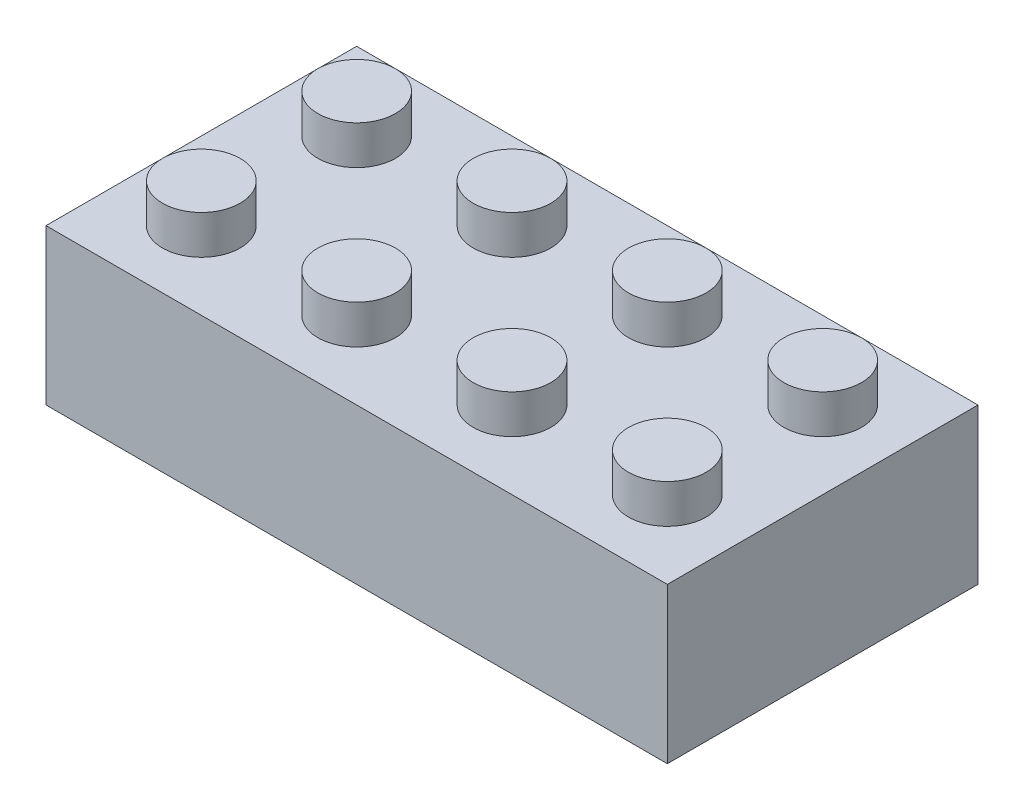
ISO-10303-21;
HEADER;
FILE_DESCRIPTION(('STEP AP214'),'2;1');
FILE_NAME('part.step','',(''),(''),'','','');
FILE_SCHEMA(('AUTOMOTIVE_DESIGN { 1 0 10303 214 1 1 1 1 }'));
ENDSEC;
DATA;
#1=APPLICATION_CONTEXT('core data for automotive mechanical design processes');
#2=APPLICATION_PROTOCOL_DEFINITION('international standard','automotive_design',2000,#1);
#3=PRODUCT_CONTEXT('',#1,'mechanical');
#4=PRODUCT('Part','Part','',(#3));
#5=PRODUCT_RELATED_PRODUCT_CATEGORY('part','',(#4));
#6=PRODUCT_DEFINITION_FORMATION('','',#4);
#7=PRODUCT_DEFINITION_CONTEXT('part definition',#1,'design');
#8=PRODUCT_DEFINITION('design','',#6,#7);
#9=PRODUCT_DEFINITION_SHAPE('','',#8);
#10=(LENGTH_UNIT() NAMED_UNIT(*) SI_UNIT(.MILLI.,.METRE.));
#11=(NAMED_UNIT(*) PLANE_ANGLE_UNIT() SI_UNIT($,.RADIAN.));
#12=(NAMED_UNIT(*) SI_UNIT($,.STERADIAN.) SOLID_ANGLE_UNIT());
#13=UNCERTAINTY_MEASURE_WITH_UNIT(LENGTH_MEASURE(1.E-05),#10,'distance_accuracy_value','');
#14=(GEOMETRIC_REPRESENTATION_CONTEXT(3) GLOBAL_UNCERTAINTY_ASSIGNED_CONTEXT((#13)) GLOBAL_UNIT_ASSIGNED_CONTEXT((#10,
#11,#12)) REPRESENTATION_CONTEXT('',''));
#15=CARTESIAN_POINT('',(0.,0.,0.));
#16=DIRECTION('',(0.,0.,1.));
#17=DIRECTION('',(1.,0.,0.));
#18=AXIS2_PLACEMENT_3D('',#15,#16,#17);
#19=CARTESIAN_POINT('',(17.78,6.35,-7.62));
#20=DIRECTION('',(0.,1.,0.));
#21=DIRECTION('',(0.,0.,1.));
#22=AXIS2_PLACEMENT_3D('',#19,#20,#21);
#23=PLANE('',#22);
#24=CARTESIAN_POINT('',(17.78,6.35,-7.62));
#25=DIRECTION('',(0.,1.,0.));
#26=DIRECTION('',(0.,0.,1.));
#27=AXIS2_PLACEMENT_3D('',#24,#25,#26);
#28=CIRCLE('',#27,1.27);
#29=CARTESIAN_POINT('',(17.78,6.35,-6.35));
#30=VERTEX_POINT('',#29);
#31=EDGE_CURVE('E11',#30,#30,#28,.T.);
#32=ORIENTED_EDGE('',*,*,#31,.T.);
#33=EDGE_LOOP('',(#32));
#34=FACE_BOUND('',#33,.T.);
#35=ADVANCED_FACE('F38',(#34),#23,.T.);
#36=CARTESIAN_POINT('',(17.78,6.35,-7.62));
#37=DIRECTION('',(0.,-1.,0.));
#38=DIRECTION('',(0.,0.,-1.));
#39=AXIS2_PLACEMENT_3D('',#36,#37,#38);
#40=CYLINDRICAL_SURFACE('',#39,1.27);
#41=ORIENTED_EDGE('',*,*,#31,.F.);
#42=EDGE_LOOP('',(#41));
#43=FACE_BOUND('',#42,.T.);
#44=CARTESIAN_POINT('',(17.78,5.08,-7.62));
#45=DIRECTION('',(0.,-1.,0.));
#46=DIRECTION('',(0.,0.,-1.));
#47=AXIS2_PLACEMENT_3D('',#44,#45,#46);
#48=CIRCLE('',#47,1.27);
#49=CARTESIAN_POINT('',(17.78,5.08,-8.89));
#50=VERTEX_POINT('',#49);
#51=EDGE_CURVE('E46',#50,#50,#48,.F.);
#52=ORIENTED_EDGE('',*,*,#51,.T.);
#53=EDGE_LOOP('',(#52));
#54=FACE_BOUND('',#53,.T.);
#55=ADVANCED_FACE('F154',(#43,#54),#40,.T.);
#56=CARTESIAN_POINT('',(12.7,6.35,-7.62));
#57=DIRECTION('',(0.,1.,0.));
#58=DIRECTION('',(0.,0.,1.));
#59=AXIS2_PLACEMENT_3D('',#56,#57,#58);
#60=PLANE('',#59);
#61=CARTESIAN_POINT('',(12.7,6.35,-7.62));
#62=DIRECTION('',(0.,1.,0.));
#63=DIRECTION('',(0.,0.,1.));
#64=AXIS2_PLACEMENT_3D('',#61,#62,#63);
#65=CIRCLE('',#64,1.27);
#66=CARTESIAN_POINT('',(12.7,6.35,-6.35));
#67=VERTEX_POINT('',#66);
#68=EDGE_CURVE('E149',#67,#67,#65,.T.);
#69=ORIENTED_EDGE('',*,*,#68,.T.);
#70=EDGE_LOOP('',(#69));
#71=FACE_BOUND('',#70,.T.);
#72=ADVANCED_FACE('F177',(#71),#60,.T.);
#73=CARTESIAN_POINT('',(12.7,6.35,-7.62));
#74=DIRECTION('',(0.,-1.,0.));
#75=DIRECTION('',(0.,0.,-1.));
#76=AXIS2_PLACEMENT_3D('',#73,#74,#75);
#77=CYLINDRICAL_SURFACE('',#76,1.27);
#78=ORIENTED_EDGE('',*,*,#68,.F.);
#79=EDGE_LOOP('',(#78));
#80=FACE_BOUND('',#79,.T.);
#81=CARTESIAN_POINT('',(12.7,5.08,-7.62));
#82=DIRECTION('',(0.,-1.,0.));
#83=DIRECTION('',(0.,0.,-1.));
#84=AXIS2_PLACEMENT_3D('',#81,#82,#83);
#85=CIRCLE('',#84,1.27);
#86=CARTESIAN_POINT('',(12.7,5.08,-8.89));
#87=VERTEX_POINT('',#86);
#88=EDGE_CURVE('E146',#87,#87,#85,.F.);
#89=ORIENTED_EDGE('',*,*,#88,.T.);
#90=EDGE_LOOP('',(#89));
#91=FACE_BOUND('',#90,.T.);
#92=ADVANCED_FACE('F183',(#80,#91),#77,.T.);
#93=CARTESIAN_POINT('',(7.62,6.35,-7.62));
#94=DIRECTION('',(0.,1.,0.));
#95=DIRECTION('',(0.,0.,1.));
#96=AXIS2_PLACEMENT_3D('',#93,#94,#95);
#97=PLANE('',#96);
#98=CARTESIAN_POINT('',(7.62,6.35,-7.62));
#99=DIRECTION('',(0.,1.,0.));
#100=DIRECTION('',(0.,0.,1.));
#101=AXIS2_PLACEMENT_3D('',#98,#99,#100);
#102=CIRCLE('',#101,1.27);
#103=CARTESIAN_POINT('',(7.62,6.35,-6.35));
#104=VERTEX_POINT('',#103);
#105=EDGE_CURVE('E143',#104,#104,#102,.T.);
#106=ORIENTED_EDGE('',*,*,#105,.T.);
#107=EDGE_LOOP('',(#106));
#108=FACE_BOUND('',#107,.T.);
#109=ADVANCED_FACE('F189',(#108),#97,.T.);
#110=CARTESIAN_POINT('',(7.62,6.35,-7.62));
#111=DIRECTION('',(0.,-1.,0.));
#112=DIRECTION('',(0.,0.,-1.));
#113=AXIS2_PLACEMENT_3D('',#110,#111,#112);
#114=CYLINDRICAL_SURFACE('',#113,1.27);
#115=ORIENTED_EDGE('',*,*,#105,.F.);
#116=EDGE_LOOP('',(#115));
#117=FACE_BOUND('',#116,.T.);
#118=CARTESIAN_POINT('',(7.62,5.08,-7.62));
#119=DIRECTION('',(0.,-1.,0.));
#120=DIRECTION('',(0.,0.,-1.));
#121=AXIS2_PLACEMENT_3D('',#118,#119,#120);
#122=CIRCLE('',#121,1.27);
#123=CARTESIAN_POINT('',(7.62,5.08,-8.89));
#124=VERTEX_POINT('',#123);
#125=EDGE_CURVE('E140',#124,#124,#122,.F.);
#126=ORIENTED_EDGE('',*,*,#125,.T.);
#127=EDGE_LOOP('',(#126));
#128=FACE_BOUND('',#127,.T.);
#129=ADVANCED_FACE('F193',(#117,#128),#114,.T.);
#130=CARTESIAN_POINT('',(2.54,6.35,-7.62));
#131=DIRECTION('',(0.,1.,0.));
#132=DIRECTION('',(0.,0.,1.));
#133=AXIS2_PLACEMENT_3D('',#130,#131,#132);
#134=PLANE('',#133);
#135=CARTESIAN_POINT('',(2.54,6.35,-7.62));
#136=DIRECTION('',(0.,1.,0.));
#137=DIRECTION('',(0.,0.,1.));
#138=AXIS2_PLACEMENT_3D('',#135,#136,#137);
#139=CIRCLE('',#138,1.27);
#140=CARTESIAN_POINT('',(2.54,6.35,-6.35));
#141=VERTEX_POINT('',#140);
#142=EDGE_CURVE('E137',#141,#141,#139,.T.);
#143=ORIENTED_EDGE('',*,*,#142,.T.);
#144=EDGE_LOOP('',(#143));
#145=FACE_BOUND('',#144,.T.);
#146=ADVANCED_FACE('F197',(#145),#134,.T.);
#147=CARTESIAN_POINT('',(2.54,6.35,-7.62));
#148=DIRECTION('',(0.,-1.,0.));
#149=DIRECTION('',(0.,0.,-1.));
#150=AXIS2_PLACEMENT_3D('',#147,#148,#149);
#151=CYLINDRICAL_SURFACE('',#150,1.27);
#152=ORIENTED_EDGE('',*,*,#142,.F.);
#153=EDGE_LOOP('',(#152));
#154=FACE_BOUND('',#153,.T.);
#155=CARTESIAN_POINT('',(2.54,5.08,-7.62));
#156=DIRECTION('',(0.,-1.,0.));
#157=DIRECTION('',(0.,0.,-1.));
#158=AXIS2_PLACEMENT_3D('',#155,#156,#157);
#159=CIRCLE('',#158,1.27);
#160=CARTESIAN_POINT('',(2.54,5.08,-8.89));
#161=VERTEX_POINT('',#160);
#162=EDGE_CURVE('E134',#161,#161,#159,.F.);
#163=ORIENTED_EDGE('',*,*,#162,.T.);
#164=EDGE_LOOP('',(#163));
#165=FACE_BOUND('',#164,.T.);
#166=ADVANCED_FACE('F201',(#154,#165),#151,.T.);
#167=CARTESIAN_POINT('',(17.78,6.35,-2.54));
#168=DIRECTION('',(0.,1.,0.));
#169=DIRECTION('',(0.,0.,1.));
#170=AXIS2_PLACEMENT_3D('',#167,#168,#169);
#171=PLANE('',#170);
#172=CARTESIAN_POINT('',(17.78,6.35,-2.54));
#173=DIRECTION('',(0.,1.,0.));
#174=DIRECTION('',(0.,0.,1.));
#175=AXIS2_PLACEMENT_3D('',#172,#173,#174);
#176=CIRCLE('',#175,1.27);
#177=CARTESIAN_POINT('',(17.78,6.35,-1.27));
#178=VERTEX_POINT('',#177);
#179=EDGE_CURVE('E131',#178,#178,#176,.T.);
#180=ORIENTED_EDGE('',*,*,#179,.T.);
#181=EDGE_LOOP('',(#180));
#182=FACE_BOUND('',#181,.T.);
#183=ADVANCED_FACE('F205',(#182),#171,.T.);
#184=CARTESIAN_POINT('',(17.78,6.35,-2.54));
#185=DIRECTION('',(0.,-1.,0.));
#186=DIRECTION('',(0.,0.,-1.));
#187=AXIS2_PLACEMENT_3D('',#184,#185,#186);
#188=CYLINDRICAL_SURFACE('',#187,1.27);
#189=ORIENTED_EDGE('',*,*,#179,.F.);
#190=EDGE_LOOP('',(#189));
#191=FACE_BOUND('',#190,.T.);
#192=CARTESIAN_POINT('',(17.78,5.08,-2.54));
#193=DIRECTION('',(0.,-1.,0.));
#194=DIRECTION('',(0.,0.,-1.));
#195=AXIS2_PLACEMENT_3D('',#192,#193,#194);
#196=CIRCLE('',#195,1.27);
#197=CARTESIAN_POINT('',(17.78,5.08,-3.81));
#198=VERTEX_POINT('',#197);
#199=EDGE_CURVE('E128',#198,#198,#196,.F.);
#200=ORIENTED_EDGE('',*,*,#199,.T.);
#201=EDGE_LOOP('',(#200));
#202=FACE_BOUND('',#201,.T.);
#203=ADVANCED_FACE('F209',(#191,#202),#188,.T.);
#204=CARTESIAN_POINT('',(12.7,6.35,-2.54));
#205=DIRECTION('',(0.,1.,0.));
#206=DIRECTION('',(0.,0.,1.));
#207=AXIS2_PLACEMENT_3D('',#204,#205,#206);
#208=PLANE('',#207);
#209=CARTESIAN_POINT('',(12.7,6.35,-2.54));
#210=DIRECTION('',(0.,1.,0.));
#211=DIRECTION('',(0.,0.,1.));
#212=AXIS2_PLACEMENT_3D('',#209,#210,#211);
#213=CIRCLE('',#212,1.27);
#214=CARTESIAN_POINT('',(12.7,6.35,-1.27));
#215=VERTEX_POINT('',#214);
#216=EDGE_CURVE('E125',#215,#215,#213,.T.);
#217=ORIENTED_EDGE('',*,*,#216,.T.);
#218=EDGE_LOOP('',(#217));
#219=FACE_BOUND('',#218,.T.);
#220=ADVANCED_FACE('F213',(#219),#208,.T.);
#221=CARTESIAN_POINT('',(12.7,6.35,-2.54));
#222=DIRECTION('',(0.,-1.,0.));
#223=DIRECTION('',(0.,0.,-1.));
#224=AXIS2_PLACEMENT_3D('',#221,#222,#223);
#225=CYLINDRICAL_SURFACE('',#224,1.27);
#226=ORIENTED_EDGE('',*,*,#216,.F.);
#227=EDGE_LOOP('',(#226));
#228=FACE_BOUND('',#227,.T.);
#229=CARTESIAN_POINT('',(12.7,5.08,-2.54));
#230=DIRECTION('',(0.,-1.,0.));
#231=DIRECTION('',(0.,0.,-1.));
#232=AXIS2_PLACEMENT_3D('',#229,#230,#231);
#233=CIRCLE('',#232,1.27);
#234=CARTESIAN_POINT('',(12.7,5.08,-3.81));
#235=VERTEX_POINT('',#234);
#236=EDGE_CURVE('E122',#235,#235,#233,.F.);
#237=ORIENTED_EDGE('',*,*,#236,.T.);
#238=EDGE_LOOP('',(#237));
#239=FACE_BOUND('',#238,.T.);
#240=ADVANCED_FACE('F217',(#228,#239),#225,.T.);
#241=CARTESIAN_POINT('',(0.,5.08,0.));
#242=DIRECTION('',(1.,0.,0.));
#243=DIRECTION('',(0.,0.,-1.));
#244=AXIS2_PLACEMENT_3D('',#241,#242,#243);
#245=PLANE('',#244);
#246=DIRECTION('',(0.,0.,1.));
#247=VECTOR('',#246,1.);
#248=CARTESIAN_POINT('',(0.,0.,0.));
#249=LINE('',#248,#247);
#250=CARTESIAN_POINT('',(0.,0.,-10.16));
#251=VERTEX_POINT('',#250);
#252=CARTESIAN_POINT('',(0.,0.,0.));
#253=VERTEX_POINT('',#252);
#254=EDGE_CURVE('E106',#251,#253,#249,.T.);
#255=ORIENTED_EDGE('',*,*,#254,.T.);
#256=DIRECTION('',(0.,-1.,0.));
#257=VECTOR('',#256,1.);
#258=CARTESIAN_POINT('',(0.,5.08,0.));
#259=LINE('',#258,#257);
#260=CARTESIAN_POINT('',(0.,5.08,0.));
#261=VERTEX_POINT('',#260);
#262=EDGE_CURVE('E97',#261,#253,#259,.T.);
#263=ORIENTED_EDGE('',*,*,#262,.F.);
#264=DIRECTION('',(0.,0.,1.));
#265=VECTOR('',#264,1.);
#266=CARTESIAN_POINT('',(0.,5.08,0.));
#267=LINE('',#266,#265);
#268=CARTESIAN_POINT('',(0.,5.08,-10.16));
#269=VERTEX_POINT('',#268);
#270=EDGE_CURVE('E91',#269,#261,#267,.T.);
#271=ORIENTED_EDGE('',*,*,#270,.F.);
#272=DIRECTION('',(0.,-1.,0.));
#273=VECTOR('',#272,1.);
#274=CARTESIAN_POINT('',(0.,5.08,-10.16));
#275=LINE('',#274,#273);
#276=EDGE_CURVE('E102',#269,#251,#275,.T.);
#277=ORIENTED_EDGE('',*,*,#276,.T.);
#278=EDGE_LOOP('',(#255,#263,#271,#277));
#279=FACE_BOUND('',#278,.T.);
#280=ADVANCED_FACE('F221',(#279),#245,.F.);
#281=CARTESIAN_POINT('',(0.,5.08,0.));
#282=DIRECTION('',(0.,0.,-1.));
#283=DIRECTION('',(-1.,0.,0.));
#284=AXIS2_PLACEMENT_3D('',#281,#282,#283);
#285=PLANE('',#284);
#286=DIRECTION('',(1.,0.,0.));
#287=VECTOR('',#286,1.);
#288=CARTESIAN_POINT('',(0.,0.,0.));
#289=LINE('',#288,#287);
#290=CARTESIAN_POINT('',(20.32,0.,0.));
#291=VERTEX_POINT('',#290);
#292=EDGE_CURVE('E96',#253,#291,#289,.T.);
#293=ORIENTED_EDGE('',*,*,#292,.T.);
#294=DIRECTION('',(0.,-1.,0.));
#295=VECTOR('',#294,1.);
#296=CARTESIAN_POINT('',(20.32,5.08,0.));
#297=LINE('',#296,#295);
#298=CARTESIAN_POINT('',(20.32,5.08,0.));
#299=VERTEX_POINT('',#298);
#300=EDGE_CURVE('E94',#299,#291,#297,.T.);
#301=ORIENTED_EDGE('',*,*,#300,.F.);
#302=DIRECTION('',(1.,0.,0.));
#303=VECTOR('',#302,1.);
#304=CARTESIAN_POINT('',(0.,5.08,0.));
#305=LINE('',#304,#303);
#306=EDGE_CURVE('E85',#261,#299,#305,.T.);
#307=ORIENTED_EDGE('',*,*,#306,.F.);
#308=ORIENTED_EDGE('',*,*,#262,.T.);
#309=EDGE_LOOP('',(#293,#301,#307,#308));
#310=FACE_BOUND('',#309,.T.);
#311=ADVANCED_FACE('F95',(#310),#285,.F.);
#312=CARTESIAN_POINT('',(20.32,5.08,0.));
#313=DIRECTION('',(-1.,0.,0.));
#314=DIRECTION('',(0.,0.,1.));
#315=AXIS2_PLACEMENT_3D('',#312,#313,#314);
#316=PLANE('',#315);
#317=DIRECTION('',(0.,0.,-1.));
#318=VECTOR('',#317,1.);
#319=CARTESIAN_POINT('',(20.32,0.,0.));
#320=LINE('',#319,#318);
#321=CARTESIAN_POINT('',(20.32,0.,-10.16));
#322=VERTEX_POINT('',#321);
#323=EDGE_CURVE('E71',#291,#322,#320,.T.);
#324=ORIENTED_EDGE('',*,*,#323,.T.);
#325=DIRECTION('',(0.,-1.,0.));
#326=VECTOR('',#325,1.);
#327=CARTESIAN_POINT('',(20.32,5.08,-10.16));
#328=LINE('',#327,#326);
#329=CARTESIAN_POINT('',(20.32,5.08,-10.16));
#330=VERTEX_POINT('',#329);
#331=EDGE_CURVE('E98',#330,#322,#328,.T.);
#332=ORIENTED_EDGE('',*,*,#331,.F.);
#333=DIRECTION('',(0.,0.,-1.));
#334=VECTOR('',#333,1.);
#335=CARTESIAN_POINT('',(20.32,5.08,0.));
#336=LINE('',#335,#334);
#337=EDGE_CURVE('E89',#299,#330,#336,.T.);
#338=ORIENTED_EDGE('',*,*,#337,.F.);
#339=ORIENTED_EDGE('',*,*,#300,.T.);
#340=EDGE_LOOP('',(#324,#332,#338,#339));
#341=FACE_BOUND('',#340,.T.);
#342=ADVANCED_FACE('F100',(#341),#316,.F.);
#343=CARTESIAN_POINT('',(0.,5.08,-10.16));
#344=DIRECTION('',(0.,0.,1.));
#345=DIRECTION('',(1.,0.,0.));
#346=AXIS2_PLACEMENT_3D('',#343,#344,#345);
#347=PLANE('',#346);
#348=DIRECTION('',(-1.,0.,0.));
#349=VECTOR('',#348,1.);
#350=CARTESIAN_POINT('',(0.,0.,-10.16));
#351=LINE('',#350,#349);
#352=EDGE_CURVE('E77',#322,#251,#351,.T.);
#353=ORIENTED_EDGE('',*,*,#352,.T.);
#354=ORIENTED_EDGE('',*,*,#276,.F.);
#355=DIRECTION('',(-1.,0.,0.));
#356=VECTOR('',#355,1.);
#357=CARTESIAN_POINT('',(0.,5.08,-10.16));
#358=LINE('',#357,#356);
#359=EDGE_CURVE('E54',#330,#269,#358,.T.);
#360=ORIENTED_EDGE('',*,*,#359,.F.);
#361=ORIENTED_EDGE('',*,*,#331,.T.);
#362=EDGE_LOOP('',(#353,#354,#360,#361));
#363=FACE_BOUND('',#362,.T.);
#364=ADVANCED_FACE('F158',(#363),#347,.F.);
#365=CARTESIAN_POINT('',(0.,5.08,0.));
#366=DIRECTION('',(0.,-1.,0.));
#367=DIRECTION('',(0.,0.,-1.));
#368=AXIS2_PLACEMENT_3D('',#365,#366,#367);
#369=PLANE('',#368);
#370=CARTESIAN_POINT('',(7.62,5.08,-2.54));
#371=DIRECTION('',(0.,-1.,0.));
#372=DIRECTION('',(0.,0.,-1.));
#373=AXIS2_PLACEMENT_3D('',#370,#371,#372);
#374=CIRCLE('',#373,1.27);
#375=CARTESIAN_POINT('',(7.62,5.08,-3.81));
#376=VERTEX_POINT('',#375);
#377=EDGE_CURVE('E119',#376,#376,#374,.F.);
#378=ORIENTED_EDGE('',*,*,#377,.F.);
#379=EDGE_LOOP('',(#378));
#380=FACE_BOUND('',#379,.T.);
#381=CARTESIAN_POINT('',(2.54,5.08,-2.54));
#382=DIRECTION('',(0.,-1.,0.));
#383=DIRECTION('',(0.,0.,-1.));
#384=AXIS2_PLACEMENT_3D('',#381,#382,#383);
#385=CIRCLE('',#384,1.27);
#386=CARTESIAN_POINT('',(2.54,5.08,-3.81));
#387=VERTEX_POINT('',#386);
#388=EDGE_CURVE('E116',#387,#387,#385,.F.);
#389=ORIENTED_EDGE('',*,*,#388,.F.);
#390=EDGE_LOOP('',(#389));
#391=FACE_BOUND('',#390,.T.);
#392=ORIENTED_EDGE('',*,*,#270,.T.);
#393=ORIENTED_EDGE('',*,*,#306,.T.);
#394=ORIENTED_EDGE('',*,*,#337,.T.);
#395=ORIENTED_EDGE('',*,*,#359,.T.);
#396=EDGE_LOOP('',(#392,#393,#394,#395));
#397=FACE_BOUND('',#396,.T.);
#398=ORIENTED_EDGE('',*,*,#236,.F.);
#399=EDGE_LOOP('',(#398));
#400=FACE_BOUND('',#399,.T.);
#401=ORIENTED_EDGE('',*,*,#199,.F.);
#402=EDGE_LOOP('',(#401));
#403=FACE_BOUND('',#402,.T.);
#404=ORIENTED_EDGE('',*,*,#162,.F.);
#405=EDGE_LOOP('',(#404));
#406=FACE_BOUND('',#405,.T.);
#407=ORIENTED_EDGE('',*,*,#125,.F.);
#408=EDGE_LOOP('',(#407));
#409=FACE_BOUND('',#408,.T.);
#410=ORIENTED_EDGE('',*,*,#88,.F.);
#411=EDGE_LOOP('',(#410));
#412=FACE_BOUND('',#411,.T.);
#413=ORIENTED_EDGE('',*,*,#51,.F.);
#414=EDGE_LOOP('',(#413));
#415=FACE_BOUND('',#414,.T.);
#416=ADVANCED_FACE('F86',(#380,#391,#397,#400,#403,#406,#409,#412,#415),#369,.F.);
#417=CARTESIAN_POINT('',(0.,0.,0.));
#418=DIRECTION('',(0.,-1.,0.));
#419=DIRECTION('',(0.,0.,-1.));
#420=AXIS2_PLACEMENT_3D('',#417,#418,#419);
#421=PLANE('',#420);
#422=ORIENTED_EDGE('',*,*,#254,.F.);
#423=ORIENTED_EDGE('',*,*,#352,.F.);
#424=ORIENTED_EDGE('',*,*,#323,.F.);
#425=ORIENTED_EDGE('',*,*,#292,.F.);
#426=EDGE_LOOP('',(#422,#423,#424,#425));
#427=FACE_BOUND('',#426,.T.);
#428=ADVANCED_FACE('F157',(#427),#421,.T.);
#429=CARTESIAN_POINT('',(2.54,6.35,-2.54));
#430=DIRECTION('',(0.,-1.,0.));
#431=DIRECTION('',(0.,0.,-1.));
#432=AXIS2_PLACEMENT_3D('',#429,#430,#431);
#433=CYLINDRICAL_SURFACE('',#432,1.27);
#434=CARTESIAN_POINT('',(2.54,6.35,-2.54));
#435=DIRECTION('',(0.,1.,0.));
#436=DIRECTION('',(0.,0.,1.));
#437=AXIS2_PLACEMENT_3D('',#434,#435,#436);
#438=CIRCLE('',#437,1.27);
#439=CARTESIAN_POINT('',(2.54,6.35,-1.27));
#440=VERTEX_POINT('',#439);
#441=EDGE_CURVE('E109',#440,#440,#438,.T.);
#442=ORIENTED_EDGE('',*,*,#441,.F.);
#443=EDGE_LOOP('',(#442));
#444=FACE_BOUND('',#443,.T.);
#445=ORIENTED_EDGE('',*,*,#388,.T.);
#446=EDGE_LOOP('',(#445));
#447=FACE_BOUND('',#446,.T.);
#448=ADVANCED_FACE('F165',(#444,#447),#433,.T.);
#449=CARTESIAN_POINT('',(2.54,6.35,-2.54));
#450=DIRECTION('',(0.,1.,0.));
#451=DIRECTION('',(0.,0.,1.));
#452=AXIS2_PLACEMENT_3D('',#449,#450,#451);
#453=PLANE('',#452);
#454=ORIENTED_EDGE('',*,*,#441,.T.);
#455=EDGE_LOOP('',(#454));
#456=FACE_BOUND('',#455,.T.);
#457=ADVANCED_FACE('F255',(#456),#453,.T.);
#458=CARTESIAN_POINT('',(7.62,6.35,-2.54));
#459=DIRECTION('',(0.,-1.,0.));
#460=DIRECTION('',(0.,0.,-1.));
#461=AXIS2_PLACEMENT_3D('',#458,#459,#460);
#462=CYLINDRICAL_SURFACE('',#461,1.27);
#463=CARTESIAN_POINT('',(7.62,6.35,-2.54));
#464=DIRECTION('',(0.,1.,0.));
#465=DIRECTION('',(0.,0.,1.));
#466=AXIS2_PLACEMENT_3D('',#463,#464,#465);
#467=CIRCLE('',#466,1.27);
#468=CARTESIAN_POINT('',(7.62,6.35,-1.27));
#469=VERTEX_POINT('',#468);
#470=EDGE_CURVE('E415',#469,#469,#467,.T.);
#471=ORIENTED_EDGE('',*,*,#470,.F.);
#472=EDGE_LOOP('',(#471));
#473=FACE_BOUND('',#472,.T.);
#474=ORIENTED_EDGE('',*,*,#377,.T.);
#475=EDGE_LOOP('',(#474));
#476=FACE_BOUND('',#475,.T.);
#477=ADVANCED_FACE('F264',(#473,#476),#462,.T.);
#478=CARTESIAN_POINT('',(7.62,6.35,-2.54));
#479=DIRECTION('',(0.,1.,0.));
#480=DIRECTION('',(0.,0.,1.));
#481=AXIS2_PLACEMENT_3D('',#478,#479,#480);
#482=PLANE('',#481);
#483=ORIENTED_EDGE('',*,*,#470,.T.);
#484=EDGE_LOOP('',(#483));
#485=FACE_BOUND('',#484,.T.);
#486=ADVANCED_FACE('F360',(#485),#482,.T.);
#487=CLOSED_SHELL('',(#35,#55,#72,#92,#109,#129,#146,#166,#183,#203,#220,#240,#280,#311,#342,
#364,#416,#428,#448,#457,#477,#486));
#488=MANIFOLD_SOLID_BREP('B2',#487);
#489=ADVANCED_BREP_SHAPE_REPRESENTATION('',(#18,#488),#14);
#490=SHAPE_DEFINITION_REPRESENTATION(#9,#489);
ENDSEC;
END-ISO-10303-21;
